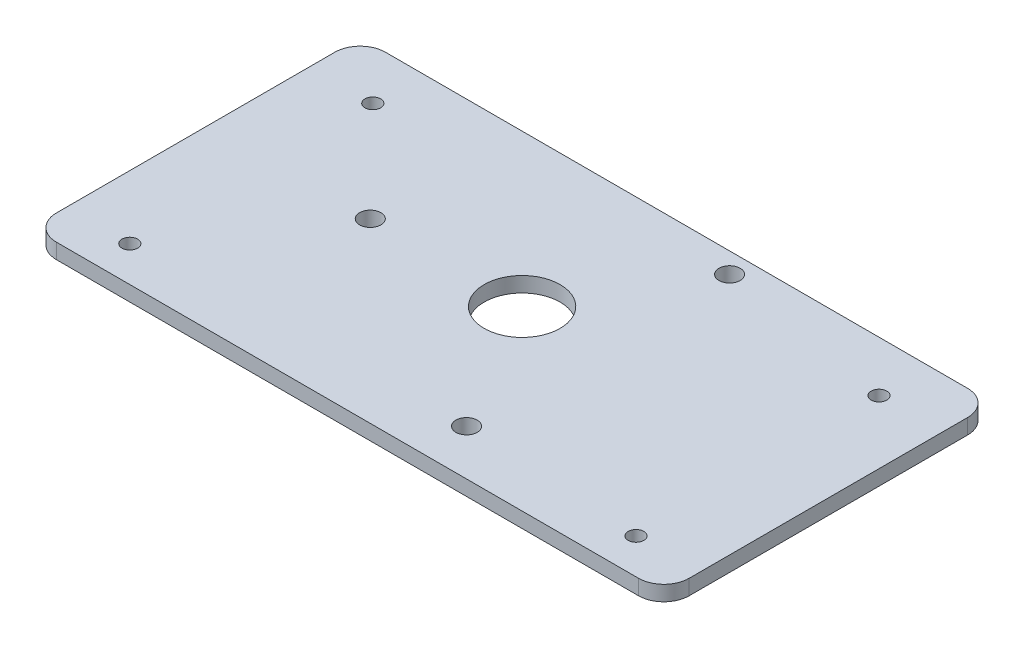
ISO-10303-21;
HEADER;
FILE_DESCRIPTION(('STEP AP214'),'2;1');
FILE_NAME('part.step','',(''),(''),'','','');
FILE_SCHEMA(('AUTOMOTIVE_DESIGN { 1 0 10303 214 1 1 1 1 }'));
ENDSEC;
DATA;
#1=APPLICATION_CONTEXT('core data for automotive mechanical design processes');
#2=APPLICATION_PROTOCOL_DEFINITION('international standard','automotive_design',2000,#1);
#3=PRODUCT_CONTEXT('',#1,'mechanical');
#4=PRODUCT('Part','Part','',(#3));
#5=PRODUCT_RELATED_PRODUCT_CATEGORY('part','',(#4));
#6=PRODUCT_DEFINITION_FORMATION('','',#4);
#7=PRODUCT_DEFINITION_CONTEXT('part definition',#1,'design');
#8=PRODUCT_DEFINITION('design','',#6,#7);
#9=PRODUCT_DEFINITION_SHAPE('','',#8);
#10=(LENGTH_UNIT() NAMED_UNIT(*) SI_UNIT(.MILLI.,.METRE.));
#11=(NAMED_UNIT(*) PLANE_ANGLE_UNIT() SI_UNIT($,.RADIAN.));
#12=(NAMED_UNIT(*) SI_UNIT($,.STERADIAN.) SOLID_ANGLE_UNIT());
#13=UNCERTAINTY_MEASURE_WITH_UNIT(LENGTH_MEASURE(1.E-05),#10,'distance_accuracy_value','');
#14=(GEOMETRIC_REPRESENTATION_CONTEXT(3) GLOBAL_UNCERTAINTY_ASSIGNED_CONTEXT((#13)) GLOBAL_UNIT_ASSIGNED_CONTEXT((#10,
#11,#12)) REPRESENTATION_CONTEXT('',''));
#15=CARTESIAN_POINT('',(0.,0.,0.));
#16=DIRECTION('',(0.,0.,1.));
#17=DIRECTION('',(1.,0.,0.));
#18=AXIS2_PLACEMENT_3D('',#15,#16,#17);
#19=CARTESIAN_POINT('',(62.5,3.,-32.5));
#20=DIRECTION('',(-1.,0.,0.));
#21=DIRECTION('',(0.,0.,1.));
#22=AXIS2_PLACEMENT_3D('',#19,#20,#21);
#23=PLANE('',#22);
#24=DIRECTION('',(0.,0.,-1.));
#25=VECTOR('',#24,1.);
#26=CARTESIAN_POINT('',(62.5,3.,-32.5));
#27=LINE('',#26,#25);
#28=CARTESIAN_POINT('',(62.5,3.,27.5));
#29=VERTEX_POINT('',#28);
#30=CARTESIAN_POINT('',(62.5,3.,-27.5));
#31=VERTEX_POINT('',#30);
#32=EDGE_CURVE('E127',#29,#31,#27,.T.);
#33=ORIENTED_EDGE('',*,*,#32,.F.);
#34=DIRECTION('',(0.,-1.,0.));
#35=VECTOR('',#34,1.);
#36=CARTESIAN_POINT('',(62.5,3.,27.5));
#37=LINE('',#36,#35);
#38=CARTESIAN_POINT('',(62.5,0.,27.5));
#39=VERTEX_POINT('',#38);
#40=EDGE_CURVE('E111',#29,#39,#37,.T.);
#41=ORIENTED_EDGE('',*,*,#40,.T.);
#42=DIRECTION('',(0.,0.,-1.));
#43=VECTOR('',#42,1.);
#44=CARTESIAN_POINT('',(62.5,0.,-32.5));
#45=LINE('',#44,#43);
#46=CARTESIAN_POINT('',(62.5,0.,-27.5));
#47=VERTEX_POINT('',#46);
#48=EDGE_CURVE('E124',#39,#47,#45,.T.);
#49=ORIENTED_EDGE('',*,*,#48,.T.);
#50=DIRECTION('',(0.,-1.,0.));
#51=VECTOR('',#50,1.);
#52=CARTESIAN_POINT('',(62.5,3.,-27.5));
#53=LINE('',#52,#51);
#54=EDGE_CURVE('E130',#47,#31,#53,.F.);
#55=ORIENTED_EDGE('',*,*,#54,.T.);
#56=EDGE_LOOP('',(#33,#41,#49,#55));
#57=FACE_BOUND('',#56,.T.);
#58=ADVANCED_FACE('F39',(#57),#23,.F.);
#59=CARTESIAN_POINT('',(-62.5,3.,-32.5));
#60=DIRECTION('',(0.,0.,1.));
#61=DIRECTION('',(1.,0.,0.));
#62=AXIS2_PLACEMENT_3D('',#59,#60,#61);
#63=PLANE('',#62);
#64=DIRECTION('',(-1.,0.,0.));
#65=VECTOR('',#64,1.);
#66=CARTESIAN_POINT('',(-62.5,3.,-32.5));
#67=LINE('',#66,#65);
#68=CARTESIAN_POINT('',(57.5,3.,-32.5));
#69=VERTEX_POINT('',#68);
#70=CARTESIAN_POINT('',(-57.5,3.,-32.5));
#71=VERTEX_POINT('',#70);
#72=EDGE_CURVE('E190',#69,#71,#67,.T.);
#73=ORIENTED_EDGE('',*,*,#72,.F.);
#74=DIRECTION('',(0.,-1.,0.));
#75=VECTOR('',#74,1.);
#76=CARTESIAN_POINT('',(57.5,3.,-32.5));
#77=LINE('',#76,#75);
#78=CARTESIAN_POINT('',(57.5,0.,-32.5));
#79=VERTEX_POINT('',#78);
#80=EDGE_CURVE('E11',#69,#79,#77,.T.);
#81=ORIENTED_EDGE('',*,*,#80,.T.);
#82=DIRECTION('',(-1.,0.,0.));
#83=VECTOR('',#82,1.);
#84=CARTESIAN_POINT('',(-62.5,0.,-32.5));
#85=LINE('',#84,#83);
#86=CARTESIAN_POINT('',(-57.5,0.,-32.5));
#87=VERTEX_POINT('',#86);
#88=EDGE_CURVE('E136',#79,#87,#85,.T.);
#89=ORIENTED_EDGE('',*,*,#88,.T.);
#90=DIRECTION('',(0.,-1.,0.));
#91=VECTOR('',#90,1.);
#92=CARTESIAN_POINT('',(-57.5,3.,-32.5));
#93=LINE('',#92,#91);
#94=EDGE_CURVE('E48',#87,#71,#93,.F.);
#95=ORIENTED_EDGE('',*,*,#94,.T.);
#96=EDGE_LOOP('',(#73,#81,#89,#95));
#97=FACE_BOUND('',#96,.T.);
#98=ADVANCED_FACE('F189',(#97),#63,.F.);
#99=CARTESIAN_POINT('',(-62.5,3.,-32.5));
#100=DIRECTION('',(1.,0.,0.));
#101=DIRECTION('',(0.,0.,-1.));
#102=AXIS2_PLACEMENT_3D('',#99,#100,#101);
#103=PLANE('',#102);
#104=DIRECTION('',(0.,0.,1.));
#105=VECTOR('',#104,1.);
#106=CARTESIAN_POINT('',(-62.5,0.,-32.5));
#107=LINE('',#106,#105);
#108=CARTESIAN_POINT('',(-62.5,0.,-27.5));
#109=VERTEX_POINT('',#108);
#110=CARTESIAN_POINT('',(-62.5,0.,27.5));
#111=VERTEX_POINT('',#110);
#112=EDGE_CURVE('E142',#109,#111,#107,.T.);
#113=ORIENTED_EDGE('',*,*,#112,.T.);
#114=DIRECTION('',(0.,-1.,0.));
#115=VECTOR('',#114,1.);
#116=CARTESIAN_POINT('',(-62.5,3.,27.5));
#117=LINE('',#116,#115);
#118=CARTESIAN_POINT('',(-62.5,3.,27.5));
#119=VERTEX_POINT('',#118);
#120=EDGE_CURVE('E55',#111,#119,#117,.F.);
#121=ORIENTED_EDGE('',*,*,#120,.T.);
#122=DIRECTION('',(0.,0.,1.));
#123=VECTOR('',#122,1.);
#124=CARTESIAN_POINT('',(-62.5,3.,-32.5));
#125=LINE('',#124,#123);
#126=CARTESIAN_POINT('',(-62.5,3.,-27.5));
#127=VERTEX_POINT('',#126);
#128=EDGE_CURVE('E197',#127,#119,#125,.T.);
#129=ORIENTED_EDGE('',*,*,#128,.F.);
#130=DIRECTION('',(0.,-1.,0.));
#131=VECTOR('',#130,1.);
#132=CARTESIAN_POINT('',(-62.5,3.,-27.5));
#133=LINE('',#132,#131);
#134=EDGE_CURVE('E180',#127,#109,#133,.T.);
#135=ORIENTED_EDGE('',*,*,#134,.T.);
#136=EDGE_LOOP('',(#113,#121,#129,#135));
#137=FACE_BOUND('',#136,.T.);
#138=ADVANCED_FACE('F201',(#137),#103,.F.);
#139=CARTESIAN_POINT('',(-62.5,3.,32.5));
#140=DIRECTION('',(0.,0.,-1.));
#141=DIRECTION('',(-1.,0.,0.));
#142=AXIS2_PLACEMENT_3D('',#139,#140,#141);
#143=PLANE('',#142);
#144=DIRECTION('',(1.,0.,0.));
#145=VECTOR('',#144,1.);
#146=CARTESIAN_POINT('',(-62.5,0.,32.5));
#147=LINE('',#146,#145);
#148=CARTESIAN_POINT('',(-57.5,0.,32.5));
#149=VERTEX_POINT('',#148);
#150=CARTESIAN_POINT('',(57.5,0.,32.5));
#151=VERTEX_POINT('',#150);
#152=EDGE_CURVE('E153',#149,#151,#147,.T.);
#153=ORIENTED_EDGE('',*,*,#152,.T.);
#154=DIRECTION('',(0.,-1.,0.));
#155=VECTOR('',#154,1.);
#156=CARTESIAN_POINT('',(57.5,3.,32.5));
#157=LINE('',#156,#155);
#158=CARTESIAN_POINT('',(57.5,3.,32.5));
#159=VERTEX_POINT('',#158);
#160=EDGE_CURVE('E112',#151,#159,#157,.F.);
#161=ORIENTED_EDGE('',*,*,#160,.T.);
#162=DIRECTION('',(1.,0.,0.));
#163=VECTOR('',#162,1.);
#164=CARTESIAN_POINT('',(-62.5,3.,32.5));
#165=LINE('',#164,#163);
#166=CARTESIAN_POINT('',(-57.5,3.,32.5));
#167=VERTEX_POINT('',#166);
#168=EDGE_CURVE('E148',#167,#159,#165,.T.);
#169=ORIENTED_EDGE('',*,*,#168,.F.);
#170=DIRECTION('',(0.,-1.,0.));
#171=VECTOR('',#170,1.);
#172=CARTESIAN_POINT('',(-57.5,3.,32.5));
#173=LINE('',#172,#171);
#174=EDGE_CURVE('E118',#167,#149,#173,.T.);
#175=ORIENTED_EDGE('',*,*,#174,.T.);
#176=EDGE_LOOP('',(#153,#161,#169,#175));
#177=FACE_BOUND('',#176,.T.);
#178=ADVANCED_FACE('F208',(#177),#143,.F.);
#179=CARTESIAN_POINT('',(0.,3.,0.));
#180=DIRECTION('',(0.,1.,0.));
#181=DIRECTION('',(0.,0.,1.));
#182=AXIS2_PLACEMENT_3D('',#179,#180,#181);
#183=PLANE('',#182);
#184=CARTESIAN_POINT('',(14.5,3.,23.4807621135332));
#185=DIRECTION('',(0.,-1.,0.));
#186=DIRECTION('',(0.,0.,-1.));
#187=AXIS2_PLACEMENT_3D('',#184,#185,#186);
#188=CIRCLE('',#187,2.1);
#189=CARTESIAN_POINT('',(14.5,3.,21.3807621135332));
#190=VERTEX_POINT('',#189);
#191=EDGE_CURVE('E238',#190,#190,#188,.T.);
#192=ORIENTED_EDGE('',*,*,#191,.T.);
#193=EDGE_LOOP('',(#192));
#194=FACE_BOUND('',#193,.T.);
#195=CARTESIAN_POINT('',(-50.,3.,25.4999999999999));
#196=DIRECTION('',(0.,-1.,0.));
#197=DIRECTION('',(0.,0.,-1.));
#198=AXIS2_PLACEMENT_3D('',#195,#196,#197);
#199=CIRCLE('',#198,1.55000000000002);
#200=CARTESIAN_POINT('',(-50.,3.,23.9499999999999));
#201=VERTEX_POINT('',#200);
#202=EDGE_CURVE('E223',#201,#201,#199,.T.);
#203=ORIENTED_EDGE('',*,*,#202,.T.);
#204=EDGE_LOOP('',(#203));
#205=FACE_BOUND('',#204,.T.);
#206=CARTESIAN_POINT('',(-49.9999999999999,3.,-22.5));
#207=DIRECTION('',(0.,-1.,0.));
#208=DIRECTION('',(0.,0.,-1.));
#209=AXIS2_PLACEMENT_3D('',#206,#207,#208);
#210=CIRCLE('',#209,1.55000000000002);
#211=CARTESIAN_POINT('',(-49.9999999999999,3.,-24.05));
#212=VERTEX_POINT('',#211);
#213=EDGE_CURVE('E222',#212,#212,#210,.T.);
#214=ORIENTED_EDGE('',*,*,#213,.T.);
#215=EDGE_LOOP('',(#214));
#216=FACE_BOUND('',#215,.T.);
#217=CARTESIAN_POINT('',(50.,3.,25.5));
#218=DIRECTION('',(0.,-1.,0.));
#219=DIRECTION('',(0.,0.,-1.));
#220=AXIS2_PLACEMENT_3D('',#217,#218,#219);
#221=CIRCLE('',#220,1.54999999999999);
#222=CARTESIAN_POINT('',(50.,3.,23.95));
#223=VERTEX_POINT('',#222);
#224=EDGE_CURVE('E216',#223,#223,#221,.T.);
#225=ORIENTED_EDGE('',*,*,#224,.T.);
#226=EDGE_LOOP('',(#225));
#227=FACE_BOUND('',#226,.T.);
#228=CARTESIAN_POINT('',(-0.500000000000043,3.,-2.49999999999995));
#229=DIRECTION('',(0.,-1.,0.));
#230=DIRECTION('',(0.,0.,-1.));
#231=AXIS2_PLACEMENT_3D('',#228,#229,#230);
#232=CIRCLE('',#231,7.5);
#233=CARTESIAN_POINT('',(-0.500000000000043,3.,-9.99999999999995));
#234=VERTEX_POINT('',#233);
#235=EDGE_CURVE('E255',#234,#234,#232,.T.);
#236=ORIENTED_EDGE('',*,*,#235,.T.);
#237=EDGE_LOOP('',(#236));
#238=FACE_BOUND('',#237,.T.);
#239=CARTESIAN_POINT('',(-30.5,3.,-2.49999999999995));
#240=DIRECTION('',(0.,-1.,0.));
#241=DIRECTION('',(0.,0.,-1.));
#242=AXIS2_PLACEMENT_3D('',#239,#240,#241);
#243=CIRCLE('',#242,2.1);
#244=CARTESIAN_POINT('',(-30.5,3.,-4.59999999999995));
#245=VERTEX_POINT('',#244);
#246=EDGE_CURVE('E254',#245,#245,#243,.T.);
#247=ORIENTED_EDGE('',*,*,#246,.T.);
#248=EDGE_LOOP('',(#247));
#249=FACE_BOUND('',#248,.T.);
#250=CARTESIAN_POINT('',(14.5,3.,-28.4807621135331));
#251=DIRECTION('',(0.,-1.,0.));
#252=DIRECTION('',(0.,0.,-1.));
#253=AXIS2_PLACEMENT_3D('',#250,#251,#252);
#254=CIRCLE('',#253,2.1);
#255=CARTESIAN_POINT('',(14.5,3.,-30.5807621135331));
#256=VERTEX_POINT('',#255);
#257=EDGE_CURVE('E239',#256,#256,#254,.T.);
#258=ORIENTED_EDGE('',*,*,#257,.T.);
#259=EDGE_LOOP('',(#258));
#260=FACE_BOUND('',#259,.T.);
#261=CARTESIAN_POINT('',(50.,3.,-22.4999999999999));
#262=DIRECTION('',(0.,-1.,0.));
#263=DIRECTION('',(0.,0.,-1.));
#264=AXIS2_PLACEMENT_3D('',#261,#262,#263);
#265=CIRCLE('',#264,1.54999999999999);
#266=CARTESIAN_POINT('',(50.,3.,-24.0499999999999));
#267=VERTEX_POINT('',#266);
#268=EDGE_CURVE('E137',#267,#267,#265,.T.);
#269=ORIENTED_EDGE('',*,*,#268,.T.);
#270=EDGE_LOOP('',(#269));
#271=FACE_BOUND('',#270,.T.);
#272=ORIENTED_EDGE('',*,*,#168,.T.);
#273=CARTESIAN_POINT('',(57.5,3.,27.5));
#274=DIRECTION('',(0.,1.,0.));
#275=DIRECTION('',(0.,0.,1.));
#276=AXIS2_PLACEMENT_3D('',#273,#274,#275);
#277=CIRCLE('',#276,5.);
#278=EDGE_CURVE('E177',#159,#29,#277,.T.);
#279=ORIENTED_EDGE('',*,*,#278,.T.);
#280=ORIENTED_EDGE('',*,*,#32,.T.);
#281=CARTESIAN_POINT('',(57.5,3.,-27.5));
#282=DIRECTION('',(0.,1.,0.));
#283=DIRECTION('',(0.,0.,1.));
#284=AXIS2_PLACEMENT_3D('',#281,#282,#283);
#285=CIRCLE('',#284,5.);
#286=EDGE_CURVE('E171',#31,#69,#285,.T.);
#287=ORIENTED_EDGE('',*,*,#286,.T.);
#288=ORIENTED_EDGE('',*,*,#72,.T.);
#289=CARTESIAN_POINT('',(-57.5,3.,-27.5));
#290=DIRECTION('',(0.,1.,0.));
#291=DIRECTION('',(0.,0.,1.));
#292=AXIS2_PLACEMENT_3D('',#289,#290,#291);
#293=CIRCLE('',#292,5.);
#294=EDGE_CURVE('E62',#71,#127,#293,.T.);
#295=ORIENTED_EDGE('',*,*,#294,.T.);
#296=ORIENTED_EDGE('',*,*,#128,.T.);
#297=CARTESIAN_POINT('',(-57.5,3.,27.5));
#298=DIRECTION('',(0.,1.,0.));
#299=DIRECTION('',(0.,0.,1.));
#300=AXIS2_PLACEMENT_3D('',#297,#298,#299);
#301=CIRCLE('',#300,5.);
#302=EDGE_CURVE('E174',#119,#167,#301,.T.);
#303=ORIENTED_EDGE('',*,*,#302,.T.);
#304=EDGE_LOOP('',(#272,#279,#280,#287,#288,#295,#296,#303));
#305=FACE_BOUND('',#304,.T.);
#306=ADVANCED_FACE('F194',(#194,#205,#216,#227,#238,#249,#260,#271,#305),#183,.T.);
#307=CARTESIAN_POINT('',(0.,0.,0.));
#308=DIRECTION('',(0.,1.,0.));
#309=DIRECTION('',(0.,0.,1.));
#310=AXIS2_PLACEMENT_3D('',#307,#308,#309);
#311=PLANE('',#310);
#312=CARTESIAN_POINT('',(14.5,0.,23.4807621135332));
#313=DIRECTION('',(0.,-1.,0.));
#314=DIRECTION('',(0.,0.,-1.));
#315=AXIS2_PLACEMENT_3D('',#312,#313,#314);
#316=CIRCLE('',#315,2.1);
#317=CARTESIAN_POINT('',(14.5,0.,21.3807621135332));
#318=VERTEX_POINT('',#317);
#319=EDGE_CURVE('E234',#318,#318,#316,.T.);
#320=ORIENTED_EDGE('',*,*,#319,.F.);
#321=EDGE_LOOP('',(#320));
#322=FACE_BOUND('',#321,.T.);
#323=CARTESIAN_POINT('',(-50.,0.,25.4999999999999));
#324=DIRECTION('',(0.,-1.,0.));
#325=DIRECTION('',(0.,0.,-1.));
#326=AXIS2_PLACEMENT_3D('',#323,#324,#325);
#327=CIRCLE('',#326,1.55000000000002);
#328=CARTESIAN_POINT('',(-50.,0.,23.9499999999999));
#329=VERTEX_POINT('',#328);
#330=EDGE_CURVE('E243',#329,#329,#327,.T.);
#331=ORIENTED_EDGE('',*,*,#330,.F.);
#332=EDGE_LOOP('',(#331));
#333=FACE_BOUND('',#332,.T.);
#334=CARTESIAN_POINT('',(-49.9999999999999,0.,-22.5));
#335=DIRECTION('',(0.,-1.,0.));
#336=DIRECTION('',(0.,0.,-1.));
#337=AXIS2_PLACEMENT_3D('',#334,#335,#336);
#338=CIRCLE('',#337,1.55000000000002);
#339=CARTESIAN_POINT('',(-49.9999999999999,0.,-24.05));
#340=VERTEX_POINT('',#339);
#341=EDGE_CURVE('E218',#340,#340,#338,.T.);
#342=ORIENTED_EDGE('',*,*,#341,.F.);
#343=EDGE_LOOP('',(#342));
#344=FACE_BOUND('',#343,.T.);
#345=CARTESIAN_POINT('',(50.,0.,25.5));
#346=DIRECTION('',(0.,-1.,0.));
#347=DIRECTION('',(0.,0.,-1.));
#348=AXIS2_PLACEMENT_3D('',#345,#346,#347);
#349=CIRCLE('',#348,1.54999999999999);
#350=CARTESIAN_POINT('',(50.,0.,23.95));
#351=VERTEX_POINT('',#350);
#352=EDGE_CURVE('E227',#351,#351,#349,.T.);
#353=ORIENTED_EDGE('',*,*,#352,.F.);
#354=EDGE_LOOP('',(#353));
#355=FACE_BOUND('',#354,.T.);
#356=CARTESIAN_POINT('',(-0.500000000000043,0.,-2.49999999999995));
#357=DIRECTION('',(0.,-1.,0.));
#358=DIRECTION('',(0.,0.,-1.));
#359=AXIS2_PLACEMENT_3D('',#356,#357,#358);
#360=CIRCLE('',#359,7.5);
#361=CARTESIAN_POINT('',(-0.500000000000043,0.,-9.99999999999995));
#362=VERTEX_POINT('',#361);
#363=EDGE_CURVE('E266',#362,#362,#360,.T.);
#364=ORIENTED_EDGE('',*,*,#363,.F.);
#365=EDGE_LOOP('',(#364));
#366=FACE_BOUND('',#365,.T.);
#367=CARTESIAN_POINT('',(-30.5,0.,-2.49999999999995));
#368=DIRECTION('',(0.,-1.,0.));
#369=DIRECTION('',(0.,0.,-1.));
#370=AXIS2_PLACEMENT_3D('',#367,#368,#369);
#371=CIRCLE('',#370,2.1);
#372=CARTESIAN_POINT('',(-30.5,0.,-4.59999999999995));
#373=VERTEX_POINT('',#372);
#374=EDGE_CURVE('E250',#373,#373,#371,.T.);
#375=ORIENTED_EDGE('',*,*,#374,.F.);
#376=EDGE_LOOP('',(#375));
#377=FACE_BOUND('',#376,.T.);
#378=CARTESIAN_POINT('',(14.5,0.,-28.4807621135331));
#379=DIRECTION('',(0.,-1.,0.));
#380=DIRECTION('',(0.,0.,-1.));
#381=AXIS2_PLACEMENT_3D('',#378,#379,#380);
#382=CIRCLE('',#381,2.1);
#383=CARTESIAN_POINT('',(14.5,0.,-30.5807621135331));
#384=VERTEX_POINT('',#383);
#385=EDGE_CURVE('E259',#384,#384,#382,.T.);
#386=ORIENTED_EDGE('',*,*,#385,.F.);
#387=EDGE_LOOP('',(#386));
#388=FACE_BOUND('',#387,.T.);
#389=CARTESIAN_POINT('',(50.,0.,-22.4999999999999));
#390=DIRECTION('',(0.,-1.,0.));
#391=DIRECTION('',(0.,0.,-1.));
#392=AXIS2_PLACEMENT_3D('',#389,#390,#391);
#393=CIRCLE('',#392,1.54999999999999);
#394=CARTESIAN_POINT('',(50.,0.,-24.0499999999999));
#395=VERTEX_POINT('',#394);
#396=EDGE_CURVE('E145',#395,#395,#393,.T.);
#397=ORIENTED_EDGE('',*,*,#396,.F.);
#398=EDGE_LOOP('',(#397));
#399=FACE_BOUND('',#398,.T.);
#400=ORIENTED_EDGE('',*,*,#48,.F.);
#401=CARTESIAN_POINT('',(57.5,0.,27.5));
#402=DIRECTION('',(0.,1.,0.));
#403=DIRECTION('',(0.,0.,1.));
#404=AXIS2_PLACEMENT_3D('',#401,#402,#403);
#405=CIRCLE('',#404,5.);
#406=EDGE_CURVE('E107',#39,#151,#405,.F.);
#407=ORIENTED_EDGE('',*,*,#406,.T.);
#408=ORIENTED_EDGE('',*,*,#152,.F.);
#409=CARTESIAN_POINT('',(-57.5,0.,27.5));
#410=DIRECTION('',(0.,1.,0.));
#411=DIRECTION('',(0.,0.,1.));
#412=AXIS2_PLACEMENT_3D('',#409,#410,#411);
#413=CIRCLE('',#412,5.);
#414=EDGE_CURVE('E119',#149,#111,#413,.F.);
#415=ORIENTED_EDGE('',*,*,#414,.T.);
#416=ORIENTED_EDGE('',*,*,#112,.F.);
#417=CARTESIAN_POINT('',(-57.5,0.,-27.5));
#418=DIRECTION('',(0.,1.,0.));
#419=DIRECTION('',(0.,0.,1.));
#420=AXIS2_PLACEMENT_3D('',#417,#418,#419);
#421=CIRCLE('',#420,5.);
#422=EDGE_CURVE('E129',#109,#87,#421,.F.);
#423=ORIENTED_EDGE('',*,*,#422,.T.);
#424=ORIENTED_EDGE('',*,*,#88,.F.);
#425=CARTESIAN_POINT('',(57.5,0.,-27.5));
#426=DIRECTION('',(0.,1.,0.));
#427=DIRECTION('',(0.,0.,1.));
#428=AXIS2_PLACEMENT_3D('',#425,#426,#427);
#429=CIRCLE('',#428,5.);
#430=EDGE_CURVE('E134',#79,#47,#429,.F.);
#431=ORIENTED_EDGE('',*,*,#430,.T.);
#432=EDGE_LOOP('',(#400,#407,#408,#415,#416,#423,#424,#431));
#433=FACE_BOUND('',#432,.T.);
#434=ADVANCED_FACE('F132',(#322,#333,#344,#355,#366,#377,#388,#399,#433),#311,.F.);
#435=CARTESIAN_POINT('',(50.,3.,-22.4999999999999));
#436=DIRECTION('',(0.,-1.,0.));
#437=DIRECTION('',(0.,0.,-1.));
#438=AXIS2_PLACEMENT_3D('',#435,#436,#437);
#439=CYLINDRICAL_SURFACE('',#438,1.54999999999999);
#440=ORIENTED_EDGE('',*,*,#268,.F.);
#441=EDGE_LOOP('',(#440));
#442=FACE_BOUND('',#441,.T.);
#443=ORIENTED_EDGE('',*,*,#396,.T.);
#444=EDGE_LOOP('',(#443));
#445=FACE_BOUND('',#444,.T.);
#446=ADVANCED_FACE('F286',(#442,#445),#439,.F.);
#447=CARTESIAN_POINT('',(14.5,3.,-28.4807621135331));
#448=DIRECTION('',(0.,-1.,0.));
#449=DIRECTION('',(0.,0.,-1.));
#450=AXIS2_PLACEMENT_3D('',#447,#448,#449);
#451=CYLINDRICAL_SURFACE('',#450,2.1);
#452=ORIENTED_EDGE('',*,*,#257,.F.);
#453=EDGE_LOOP('',(#452));
#454=FACE_BOUND('',#453,.T.);
#455=ORIENTED_EDGE('',*,*,#385,.T.);
#456=EDGE_LOOP('',(#455));
#457=FACE_BOUND('',#456,.T.);
#458=ADVANCED_FACE('F296',(#454,#457),#451,.F.);
#459=CARTESIAN_POINT('',(-30.5,3.,-2.49999999999995));
#460=DIRECTION('',(0.,-1.,0.));
#461=DIRECTION('',(0.,0.,-1.));
#462=AXIS2_PLACEMENT_3D('',#459,#460,#461);
#463=CYLINDRICAL_SURFACE('',#462,2.1);
#464=ORIENTED_EDGE('',*,*,#246,.F.);
#465=EDGE_LOOP('',(#464));
#466=FACE_BOUND('',#465,.T.);
#467=ORIENTED_EDGE('',*,*,#374,.T.);
#468=EDGE_LOOP('',(#467));
#469=FACE_BOUND('',#468,.T.);
#470=ADVANCED_FACE('F280',(#466,#469),#463,.F.);
#471=CARTESIAN_POINT('',(-0.500000000000043,3.,-2.49999999999995));
#472=DIRECTION('',(0.,-1.,0.));
#473=DIRECTION('',(0.,0.,-1.));
#474=AXIS2_PLACEMENT_3D('',#471,#472,#473);
#475=CYLINDRICAL_SURFACE('',#474,7.5);
#476=ORIENTED_EDGE('',*,*,#235,.F.);
#477=EDGE_LOOP('',(#476));
#478=FACE_BOUND('',#477,.T.);
#479=ORIENTED_EDGE('',*,*,#363,.T.);
#480=EDGE_LOOP('',(#479));
#481=FACE_BOUND('',#480,.T.);
#482=ADVANCED_FACE('F276',(#478,#481),#475,.F.);
#483=CARTESIAN_POINT('',(50.,3.,25.5));
#484=DIRECTION('',(0.,-1.,0.));
#485=DIRECTION('',(0.,0.,-1.));
#486=AXIS2_PLACEMENT_3D('',#483,#484,#485);
#487=CYLINDRICAL_SURFACE('',#486,1.54999999999999);
#488=ORIENTED_EDGE('',*,*,#224,.F.);
#489=EDGE_LOOP('',(#488));
#490=FACE_BOUND('',#489,.T.);
#491=ORIENTED_EDGE('',*,*,#352,.T.);
#492=EDGE_LOOP('',(#491));
#493=FACE_BOUND('',#492,.T.);
#494=ADVANCED_FACE('F279',(#490,#493),#487,.F.);
#495=CARTESIAN_POINT('',(-49.9999999999999,3.,-22.5));
#496=DIRECTION('',(0.,-1.,0.));
#497=DIRECTION('',(0.,0.,-1.));
#498=AXIS2_PLACEMENT_3D('',#495,#496,#497);
#499=CYLINDRICAL_SURFACE('',#498,1.55000000000002);
#500=ORIENTED_EDGE('',*,*,#213,.F.);
#501=EDGE_LOOP('',(#500));
#502=FACE_BOUND('',#501,.T.);
#503=ORIENTED_EDGE('',*,*,#341,.T.);
#504=EDGE_LOOP('',(#503));
#505=FACE_BOUND('',#504,.T.);
#506=ADVANCED_FACE('F402',(#502,#505),#499,.F.);
#507=CARTESIAN_POINT('',(-50.,3.,25.4999999999999));
#508=DIRECTION('',(0.,-1.,0.));
#509=DIRECTION('',(0.,0.,-1.));
#510=AXIS2_PLACEMENT_3D('',#507,#508,#509);
#511=CYLINDRICAL_SURFACE('',#510,1.55000000000002);
#512=ORIENTED_EDGE('',*,*,#202,.F.);
#513=EDGE_LOOP('',(#512));
#514=FACE_BOUND('',#513,.T.);
#515=ORIENTED_EDGE('',*,*,#330,.T.);
#516=EDGE_LOOP('',(#515));
#517=FACE_BOUND('',#516,.T.);
#518=ADVANCED_FACE('F392',(#514,#517),#511,.F.);
#519=CARTESIAN_POINT('',(14.5,3.,23.4807621135332));
#520=DIRECTION('',(0.,-1.,0.));
#521=DIRECTION('',(0.,0.,-1.));
#522=AXIS2_PLACEMENT_3D('',#519,#520,#521);
#523=CYLINDRICAL_SURFACE('',#522,2.1);
#524=ORIENTED_EDGE('',*,*,#191,.F.);
#525=EDGE_LOOP('',(#524));
#526=FACE_BOUND('',#525,.T.);
#527=ORIENTED_EDGE('',*,*,#319,.T.);
#528=EDGE_LOOP('',(#527));
#529=FACE_BOUND('',#528,.T.);
#530=ADVANCED_FACE('F317',(#526,#529),#523,.F.);
#531=CARTESIAN_POINT('',(57.5,3.,27.5));
#532=DIRECTION('',(0.,-1.,0.));
#533=DIRECTION('',(0.,0.,-1.));
#534=AXIS2_PLACEMENT_3D('',#531,#532,#533);
#535=CYLINDRICAL_SURFACE('',#534,5.);
#536=ORIENTED_EDGE('',*,*,#278,.F.);
#537=ORIENTED_EDGE('',*,*,#160,.F.);
#538=ORIENTED_EDGE('',*,*,#406,.F.);
#539=ORIENTED_EDGE('',*,*,#40,.F.);
#540=EDGE_LOOP('',(#536,#537,#538,#539));
#541=FACE_BOUND('',#540,.T.);
#542=ADVANCED_FACE('F110',(#541),#535,.T.);
#543=CARTESIAN_POINT('',(-57.5,3.,27.5));
#544=DIRECTION('',(0.,-1.,0.));
#545=DIRECTION('',(0.,0.,-1.));
#546=AXIS2_PLACEMENT_3D('',#543,#544,#545);
#547=CYLINDRICAL_SURFACE('',#546,5.);
#548=ORIENTED_EDGE('',*,*,#302,.F.);
#549=ORIENTED_EDGE('',*,*,#120,.F.);
#550=ORIENTED_EDGE('',*,*,#414,.F.);
#551=ORIENTED_EDGE('',*,*,#174,.F.);
#552=EDGE_LOOP('',(#548,#549,#550,#551));
#553=FACE_BOUND('',#552,.T.);
#554=ADVANCED_FACE('F205',(#553),#547,.T.);
#555=CARTESIAN_POINT('',(57.5,3.,-27.5));
#556=DIRECTION('',(0.,-1.,0.));
#557=DIRECTION('',(0.,0.,-1.));
#558=AXIS2_PLACEMENT_3D('',#555,#556,#557);
#559=CYLINDRICAL_SURFACE('',#558,5.);
#560=ORIENTED_EDGE('',*,*,#286,.F.);
#561=ORIENTED_EDGE('',*,*,#54,.F.);
#562=ORIENTED_EDGE('',*,*,#430,.F.);
#563=ORIENTED_EDGE('',*,*,#80,.F.);
#564=EDGE_LOOP('',(#560,#561,#562,#563));
#565=FACE_BOUND('',#564,.T.);
#566=ADVANCED_FACE('F319',(#565),#559,.T.);
#567=CARTESIAN_POINT('',(-57.5,3.,-27.5));
#568=DIRECTION('',(0.,-1.,0.));
#569=DIRECTION('',(0.,0.,-1.));
#570=AXIS2_PLACEMENT_3D('',#567,#568,#569);
#571=CYLINDRICAL_SURFACE('',#570,5.);
#572=ORIENTED_EDGE('',*,*,#294,.F.);
#573=ORIENTED_EDGE('',*,*,#94,.F.);
#574=ORIENTED_EDGE('',*,*,#422,.F.);
#575=ORIENTED_EDGE('',*,*,#134,.F.);
#576=EDGE_LOOP('',(#572,#573,#574,#575));
#577=FACE_BOUND('',#576,.T.);
#578=ADVANCED_FACE('F41',(#577),#571,.T.);
#579=CLOSED_SHELL('',(#58,#98,#138,#178,#306,#434,#446,#458,#470,#482,#494,#506,#518,#530,#542,
#554,#566,#578));
#580=MANIFOLD_SOLID_BREP('B2',#579);
#581=ADVANCED_BREP_SHAPE_REPRESENTATION('',(#18,#580),#14);
#582=SHAPE_DEFINITION_REPRESENTATION(#9,#581);
ENDSEC;
END-ISO-10303-21;
